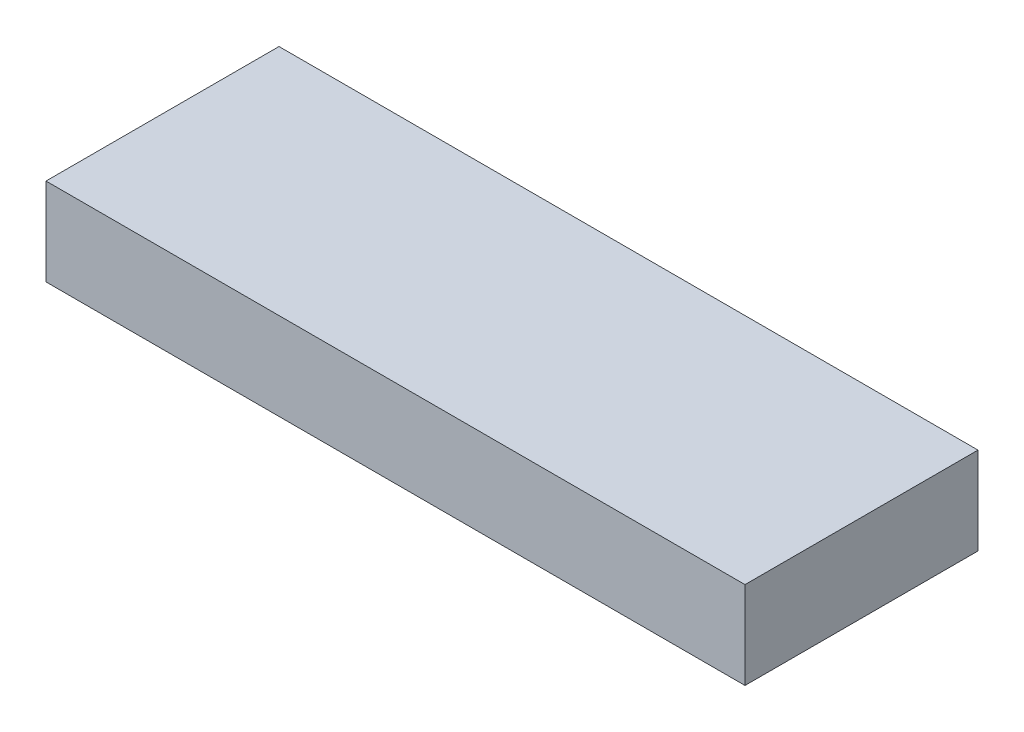
ISO-10303-21;
HEADER;
FILE_DESCRIPTION(('STEP AP214'),'2;1');
FILE_NAME('part.step','',(''),(''),'','','');
FILE_SCHEMA(('AUTOMOTIVE_DESIGN { 1 0 10303 214 1 1 1 1 }'));
ENDSEC;
DATA;
#1=APPLICATION_CONTEXT('core data for automotive mechanical design processes');
#2=APPLICATION_PROTOCOL_DEFINITION('international standard','automotive_design',2000,#1);
#3=PRODUCT_CONTEXT('',#1,'mechanical');
#4=PRODUCT('Part','Part','',(#3));
#5=PRODUCT_RELATED_PRODUCT_CATEGORY('part','',(#4));
#6=PRODUCT_DEFINITION_FORMATION('','',#4);
#7=PRODUCT_DEFINITION_CONTEXT('part definition',#1,'design');
#8=PRODUCT_DEFINITION('design','',#6,#7);
#9=PRODUCT_DEFINITION_SHAPE('','',#8);
#10=(LENGTH_UNIT() NAMED_UNIT(*) SI_UNIT(.MILLI.,.METRE.));
#11=(NAMED_UNIT(*) PLANE_ANGLE_UNIT() SI_UNIT($,.RADIAN.));
#12=(NAMED_UNIT(*) SI_UNIT($,.STERADIAN.) SOLID_ANGLE_UNIT());
#13=UNCERTAINTY_MEASURE_WITH_UNIT(LENGTH_MEASURE(1.E-05),#10,'distance_accuracy_value','');
#14=(GEOMETRIC_REPRESENTATION_CONTEXT(3) GLOBAL_UNCERTAINTY_ASSIGNED_CONTEXT((#13)) GLOBAL_UNIT_ASSIGNED_CONTEXT((#10,
#11,#12)) REPRESENTATION_CONTEXT('',''));
#15=CARTESIAN_POINT('',(0.,0.,0.));
#16=DIRECTION('',(0.,0.,1.));
#17=DIRECTION('',(1.,0.,0.));
#18=AXIS2_PLACEMENT_3D('',#15,#16,#17);
#19=CARTESIAN_POINT('',(-4.08849557522124,1.5,-2.41592920353982));
#20=DIRECTION('',(1.,0.,0.));
#21=DIRECTION('',(0.,0.,-1.));
#22=AXIS2_PLACEMENT_3D('',#19,#20,#21);
#23=PLANE('',#22);
#24=DIRECTION('',(0.,0.,1.));
#25=VECTOR('',#24,1.);
#26=CARTESIAN_POINT('',(-4.08849557522124,0.,-2.41592920353982));
#27=LINE('',#26,#25);
#28=CARTESIAN_POINT('',(-4.08849557522124,0.,-2.41592920353982));
#29=VERTEX_POINT('',#28);
#30=CARTESIAN_POINT('',(-4.08849557522124,0.,1.58407079646018));
#31=VERTEX_POINT('',#30);
#32=EDGE_CURVE('E100',#29,#31,#27,.T.);
#33=ORIENTED_EDGE('',*,*,#32,.T.);
#34=DIRECTION('',(0.,-1.,0.));
#35=VECTOR('',#34,1.);
#36=CARTESIAN_POINT('',(-4.08849557522124,1.5,1.58407079646018));
#37=LINE('',#36,#35);
#38=CARTESIAN_POINT('',(-4.08849557522124,1.5,1.58407079646018));
#39=VERTEX_POINT('',#38);
#40=EDGE_CURVE('E11',#39,#31,#37,.T.);
#41=ORIENTED_EDGE('',*,*,#40,.F.);
#42=DIRECTION('',(0.,0.,1.));
#43=VECTOR('',#42,1.);
#44=CARTESIAN_POINT('',(-4.08849557522124,1.5,-2.41592920353982));
#45=LINE('',#44,#43);
#46=CARTESIAN_POINT('',(-4.08849557522124,1.5,-2.41592920353982));
#47=VERTEX_POINT('',#46);
#48=EDGE_CURVE('E88',#47,#39,#45,.T.);
#49=ORIENTED_EDGE('',*,*,#48,.F.);
#50=DIRECTION('',(0.,-1.,0.));
#51=VECTOR('',#50,1.);
#52=CARTESIAN_POINT('',(-4.08849557522124,1.5,-2.41592920353982));
#53=LINE('',#52,#51);
#54=EDGE_CURVE('E96',#47,#29,#53,.T.);
#55=ORIENTED_EDGE('',*,*,#54,.T.);
#56=EDGE_LOOP('',(#33,#41,#49,#55));
#57=FACE_BOUND('',#56,.T.);
#58=ADVANCED_FACE('F37',(#57),#23,.F.);
#59=CARTESIAN_POINT('',(-4.08849557522124,1.5,1.58407079646018));
#60=DIRECTION('',(0.,0.,-1.));
#61=DIRECTION('',(-1.,0.,0.));
#62=AXIS2_PLACEMENT_3D('',#59,#60,#61);
#63=PLANE('',#62);
#64=DIRECTION('',(1.,0.,0.));
#65=VECTOR('',#64,1.);
#66=CARTESIAN_POINT('',(-4.08849557522124,0.,1.58407079646018));
#67=LINE('',#66,#65);
#68=CARTESIAN_POINT('',(7.91150442477876,0.,1.58407079646018));
#69=VERTEX_POINT('',#68);
#70=EDGE_CURVE('E92',#31,#69,#67,.T.);
#71=ORIENTED_EDGE('',*,*,#70,.T.);
#72=DIRECTION('',(0.,-1.,0.));
#73=VECTOR('',#72,1.);
#74=CARTESIAN_POINT('',(7.91150442477876,1.5,1.58407079646018));
#75=LINE('',#74,#73);
#76=CARTESIAN_POINT('',(7.91150442477876,1.5,1.58407079646018));
#77=VERTEX_POINT('',#76);
#78=EDGE_CURVE('E45',#77,#69,#75,.T.);
#79=ORIENTED_EDGE('',*,*,#78,.F.);
#80=DIRECTION('',(1.,0.,0.));
#81=VECTOR('',#80,1.);
#82=CARTESIAN_POINT('',(-4.08849557522124,1.5,1.58407079646018));
#83=LINE('',#82,#81);
#84=EDGE_CURVE('E83',#39,#77,#83,.T.);
#85=ORIENTED_EDGE('',*,*,#84,.F.);
#86=ORIENTED_EDGE('',*,*,#40,.T.);
#87=EDGE_LOOP('',(#71,#79,#85,#86));
#88=FACE_BOUND('',#87,.T.);
#89=ADVANCED_FACE('F91',(#88),#63,.F.);
#90=CARTESIAN_POINT('',(7.91150442477876,1.5,-2.41592920353982));
#91=DIRECTION('',(-1.,0.,0.));
#92=DIRECTION('',(0.,0.,1.));
#93=AXIS2_PLACEMENT_3D('',#90,#91,#92);
#94=PLANE('',#93);
#95=DIRECTION('',(0.,0.,-1.));
#96=VECTOR('',#95,1.);
#97=CARTESIAN_POINT('',(7.91150442477876,0.,-2.41592920353982));
#98=LINE('',#97,#96);
#99=CARTESIAN_POINT('',(7.91150442477876,0.,-2.41592920353982));
#100=VERTEX_POINT('',#99);
#101=EDGE_CURVE('E70',#69,#100,#98,.T.);
#102=ORIENTED_EDGE('',*,*,#101,.T.);
#103=DIRECTION('',(0.,-1.,0.));
#104=VECTOR('',#103,1.);
#105=CARTESIAN_POINT('',(7.91150442477876,1.5,-2.41592920353982));
#106=LINE('',#105,#104);
#107=CARTESIAN_POINT('',(7.91150442477876,1.5,-2.41592920353982));
#108=VERTEX_POINT('',#107);
#109=EDGE_CURVE('E93',#108,#100,#106,.T.);
#110=ORIENTED_EDGE('',*,*,#109,.F.);
#111=DIRECTION('',(0.,0.,-1.));
#112=VECTOR('',#111,1.);
#113=CARTESIAN_POINT('',(7.91150442477876,1.5,-2.41592920353982));
#114=LINE('',#113,#112);
#115=EDGE_CURVE('E86',#77,#108,#114,.T.);
#116=ORIENTED_EDGE('',*,*,#115,.F.);
#117=ORIENTED_EDGE('',*,*,#78,.T.);
#118=EDGE_LOOP('',(#102,#110,#116,#117));
#119=FACE_BOUND('',#118,.T.);
#120=ADVANCED_FACE('F94',(#119),#94,.F.);
#121=CARTESIAN_POINT('',(-4.08849557522124,1.5,-2.41592920353982));
#122=DIRECTION('',(0.,0.,1.));
#123=DIRECTION('',(1.,0.,0.));
#124=AXIS2_PLACEMENT_3D('',#121,#122,#123);
#125=PLANE('',#124);
#126=DIRECTION('',(-1.,0.,0.));
#127=VECTOR('',#126,1.);
#128=CARTESIAN_POINT('',(-4.08849557522124,0.,-2.41592920353982));
#129=LINE('',#128,#127);
#130=EDGE_CURVE('E76',#100,#29,#129,.T.);
#131=ORIENTED_EDGE('',*,*,#130,.T.);
#132=ORIENTED_EDGE('',*,*,#54,.F.);
#133=DIRECTION('',(-1.,0.,0.));
#134=VECTOR('',#133,1.);
#135=CARTESIAN_POINT('',(-4.08849557522124,1.5,-2.41592920353982));
#136=LINE('',#135,#134);
#137=EDGE_CURVE('E53',#108,#47,#136,.T.);
#138=ORIENTED_EDGE('',*,*,#137,.F.);
#139=ORIENTED_EDGE('',*,*,#109,.T.);
#140=EDGE_LOOP('',(#131,#132,#138,#139));
#141=FACE_BOUND('',#140,.T.);
#142=ADVANCED_FACE('F107',(#141),#125,.F.);
#143=CARTESIAN_POINT('',(0.,1.5,0.));
#144=DIRECTION('',(0.,1.,0.));
#145=DIRECTION('',(0.,0.,1.));
#146=AXIS2_PLACEMENT_3D('',#143,#144,#145);
#147=PLANE('',#146);
#148=ORIENTED_EDGE('',*,*,#48,.T.);
#149=ORIENTED_EDGE('',*,*,#84,.T.);
#150=ORIENTED_EDGE('',*,*,#115,.T.);
#151=ORIENTED_EDGE('',*,*,#137,.T.);
#152=EDGE_LOOP('',(#148,#149,#150,#151));
#153=FACE_BOUND('',#152,.T.);
#154=ADVANCED_FACE('F84',(#153),#147,.T.);
#155=CARTESIAN_POINT('',(0.,0.,0.));
#156=DIRECTION('',(0.,1.,0.));
#157=DIRECTION('',(0.,0.,1.));
#158=AXIS2_PLACEMENT_3D('',#155,#156,#157);
#159=PLANE('',#158);
#160=ORIENTED_EDGE('',*,*,#32,.F.);
#161=ORIENTED_EDGE('',*,*,#130,.F.);
#162=ORIENTED_EDGE('',*,*,#101,.F.);
#163=ORIENTED_EDGE('',*,*,#70,.F.);
#164=EDGE_LOOP('',(#160,#161,#162,#163));
#165=FACE_BOUND('',#164,.T.);
#166=ADVANCED_FACE('F110',(#165),#159,.F.);
#167=CLOSED_SHELL('',(#58,#89,#120,#142,#154,#166));
#168=MANIFOLD_SOLID_BREP('B2',#167);
#169=ADVANCED_BREP_SHAPE_REPRESENTATION('',(#18,#168),#14);
#170=SHAPE_DEFINITION_REPRESENTATION(#9,#169);
ENDSEC;
END-ISO-10303-21;
